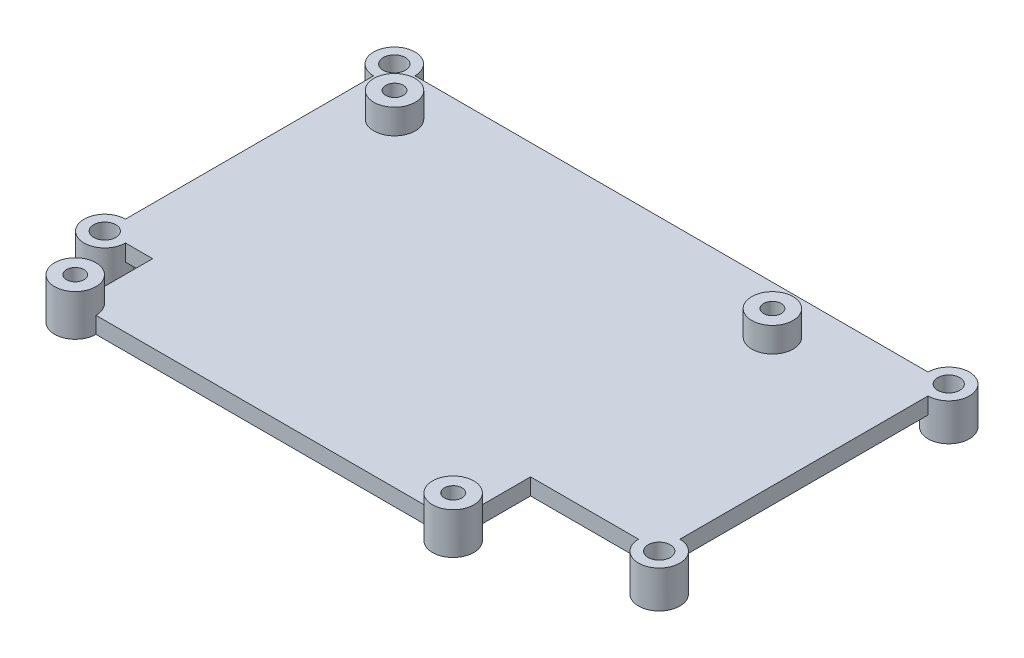
ISO-10303-21;
HEADER;
FILE_DESCRIPTION(('STEP AP214'),'2;1');
FILE_NAME('part.step','',(''),(''),'','','');
FILE_SCHEMA(('AUTOMOTIVE_DESIGN { 1 0 10303 214 1 1 1 1 }'));
ENDSEC;
DATA;
#1=APPLICATION_CONTEXT('core data for automotive mechanical design processes');
#2=APPLICATION_PROTOCOL_DEFINITION('international standard','automotive_design',2000,#1);
#3=PRODUCT_CONTEXT('',#1,'mechanical');
#4=PRODUCT('Part','Part','',(#3));
#5=PRODUCT_RELATED_PRODUCT_CATEGORY('part','',(#4));
#6=PRODUCT_DEFINITION_FORMATION('','',#4);
#7=PRODUCT_DEFINITION_CONTEXT('part definition',#1,'design');
#8=PRODUCT_DEFINITION('design','',#6,#7);
#9=PRODUCT_DEFINITION_SHAPE('','',#8);
#10=(LENGTH_UNIT() NAMED_UNIT(*) SI_UNIT(.MILLI.,.METRE.));
#11=(NAMED_UNIT(*) PLANE_ANGLE_UNIT() SI_UNIT($,.RADIAN.));
#12=(NAMED_UNIT(*) SI_UNIT($,.STERADIAN.) SOLID_ANGLE_UNIT());
#13=UNCERTAINTY_MEASURE_WITH_UNIT(LENGTH_MEASURE(1.E-05),#10,'distance_accuracy_value','');
#14=(GEOMETRIC_REPRESENTATION_CONTEXT(3) GLOBAL_UNCERTAINTY_ASSIGNED_CONTEXT((#13)) GLOBAL_UNIT_ASSIGNED_CONTEXT((#10,
#11,#12)) REPRESENTATION_CONTEXT('',''));
#15=CARTESIAN_POINT('',(0.,0.,0.));
#16=DIRECTION('',(0.,0.,1.));
#17=DIRECTION('',(1.,0.,0.));
#18=AXIS2_PLACEMENT_3D('',#15,#16,#17);
#19=CARTESIAN_POINT('',(0.,2.54,0.));
#20=DIRECTION('',(0.,1.,0.));
#21=DIRECTION('',(0.,0.,1.));
#22=AXIS2_PLACEMENT_3D('',#19,#20,#21);
#23=PLANE('',#22);
#24=CARTESIAN_POINT('',(178.110999752416,2.54,106.660124546003));
#25=DIRECTION('',(0.,1.,0.));
#26=DIRECTION('',(0.,0.,1.));
#27=AXIS2_PLACEMENT_3D('',#24,#25,#26);
#28=CIRCLE('',#27,1.69999999999996);
#29=CARTESIAN_POINT('',(178.110999752416,2.54,108.360124546003));
#30=VERTEX_POINT('',#29);
#31=EDGE_CURVE('E187',#30,#30,#28,.T.);
#32=ORIENTED_EDGE('',*,*,#31,.F.);
#33=EDGE_LOOP('',(#32));
#34=FACE_BOUND('',#33,.T.);
#35=CARTESIAN_POINT('',(178.108885441775,2.54,62.2211245963));
#36=DIRECTION('',(0.,1.,0.));
#37=DIRECTION('',(0.,0.,1.));
#38=AXIS2_PLACEMENT_3D('',#35,#36,#37);
#39=CIRCLE('',#38,1.69999999999996);
#40=CARTESIAN_POINT('',(178.108885441775,2.54,63.9211245963));
#41=VERTEX_POINT('',#40);
#42=EDGE_CURVE('E184',#41,#41,#39,.T.);
#43=ORIENTED_EDGE('',*,*,#42,.F.);
#44=EDGE_LOOP('',(#43));
#45=FACE_BOUND('',#44,.T.);
#46=CARTESIAN_POINT('',(93.0188855380824,2.54,62.2251729928077));
#47=DIRECTION('',(0.,1.,0.));
#48=DIRECTION('',(0.,0.,1.));
#49=AXIS2_PLACEMENT_3D('',#46,#47,#48);
#50=CIRCLE('',#49,1.69999999999998);
#51=CARTESIAN_POINT('',(93.0188855380824,2.54,63.9251729928077));
#52=VERTEX_POINT('',#51);
#53=EDGE_CURVE('E181',#52,#52,#50,.T.);
#54=ORIENTED_EDGE('',*,*,#53,.F.);
#55=EDGE_LOOP('',(#54));
#56=FACE_BOUND('',#55,.T.);
#57=CARTESIAN_POINT('',(93.020999848723,2.54,106.664172942511));
#58=DIRECTION('',(0.,1.,0.));
#59=DIRECTION('',(0.,0.,1.));
#60=AXIS2_PLACEMENT_3D('',#57,#58,#59);
#61=CIRCLE('',#60,1.69999999999999);
#62=CARTESIAN_POINT('',(93.020999848723,2.54,108.364172942511));
#63=VERTEX_POINT('',#62);
#64=EDGE_CURVE('E178',#63,#63,#61,.T.);
#65=ORIENTED_EDGE('',*,*,#64,.F.);
#66=EDGE_LOOP('',(#65));
#67=FACE_BOUND('',#66,.T.);
#68=CARTESIAN_POINT('',(100.361892411945,2.54,69.5351729928077));
#69=DIRECTION('',(0.,1.,0.));
#70=DIRECTION('',(0.,0.,1.));
#71=AXIS2_PLACEMENT_3D('',#68,#69,#70);
#72=CIRCLE('',#71,3.175);
#73=CARTESIAN_POINT('',(100.361892411945,2.54,72.7101729928077));
#74=VERTEX_POINT('',#73);
#75=EDGE_CURVE('E264',#74,#74,#72,.F.);
#76=ORIENTED_EDGE('',*,*,#75,.T.);
#77=EDGE_LOOP('',(#76));
#78=FACE_BOUND('',#77,.T.);
#79=CARTESIAN_POINT('',(158.361892411945,2.54,69.5351729928077));
#80=DIRECTION('',(0.,1.,0.));
#81=DIRECTION('',(0.,0.,1.));
#82=AXIS2_PLACEMENT_3D('',#79,#80,#81);
#83=CIRCLE('',#82,3.175);
#84=CARTESIAN_POINT('',(158.361892411945,2.54,72.7101729928077));
#85=VERTEX_POINT('',#84);
#86=EDGE_CURVE('E268',#85,#85,#83,.F.);
#87=ORIENTED_EDGE('',*,*,#86,.T.);
#88=EDGE_LOOP('',(#87));
#89=FACE_BOUND('',#88,.T.);
#90=DIRECTION('',(1.,0.,0.));
#91=VECTOR('',#90,1.);
#92=CARTESIAN_POINT('',(0.,2.54,118.535172992808));
#93=LINE('',#92,#91);
#94=CARTESIAN_POINT('',(103.536892411945,2.54,118.535172992808));
#95=VERTEX_POINT('',#94);
#96=CARTESIAN_POINT('',(155.186892411945,2.54,118.535172992808));
#97=VERTEX_POINT('',#96);
#98=EDGE_CURVE('E337',#95,#97,#93,.T.);
#99=ORIENTED_EDGE('',*,*,#98,.T.);
#100=CARTESIAN_POINT('',(158.361892411945,2.54,118.535172992808));
#101=DIRECTION('',(0.,1.,0.));
#102=DIRECTION('',(0.,0.,1.));
#103=AXIS2_PLACEMENT_3D('',#100,#101,#102);
#104=CIRCLE('',#103,3.175);
#105=CARTESIAN_POINT('',(158.361892411945,2.54,115.360172992808));
#106=VERTEX_POINT('',#105);
#107=EDGE_CURVE('E11',#97,#106,#104,.F.);
#108=ORIENTED_EDGE('',*,*,#107,.T.);
#109=DIRECTION('',(0.,0.,1.));
#110=VECTOR('',#109,1.);
#111=CARTESIAN_POINT('',(158.361892411945,2.54,0.));
#112=LINE('',#111,#110);
#113=CARTESIAN_POINT('',(158.361892411945,2.54,106.660124546003));
#114=VERTEX_POINT('',#113);
#115=EDGE_CURVE('E339',#114,#106,#112,.T.);
#116=ORIENTED_EDGE('',*,*,#115,.F.);
#117=DIRECTION('',(1.,0.,0.));
#118=VECTOR('',#117,1.);
#119=CARTESIAN_POINT('',(0.,2.54,106.660124546003));
#120=LINE('',#119,#118);
#121=CARTESIAN_POINT('',(174.935999752416,2.54,106.660124546003));
#122=VERTEX_POINT('',#121);
#123=EDGE_CURVE('E342',#114,#122,#120,.T.);
#124=ORIENTED_EDGE('',*,*,#123,.T.);
#125=CARTESIAN_POINT('',(178.110999752416,2.54,106.660124546003));
#126=DIRECTION('',(0.,1.,0.));
#127=DIRECTION('',(0.,0.,1.));
#128=AXIS2_PLACEMENT_3D('',#125,#126,#127);
#129=CIRCLE('',#128,3.17499999999998);
#130=CARTESIAN_POINT('',(178.110999752416,2.54,103.485124546003));
#131=VERTEX_POINT('',#130);
#132=EDGE_CURVE('E344',#122,#131,#129,.T.);
#133=ORIENTED_EDGE('',*,*,#132,.T.);
#134=DIRECTION('',(0.,0.,1.));
#135=VECTOR('',#134,1.);
#136=CARTESIAN_POINT('',(178.110999752416,2.54,0.));
#137=LINE('',#136,#135);
#138=CARTESIAN_POINT('',(178.110999752416,2.54,65.3961238923142));
#139=VERTEX_POINT('',#138);
#140=EDGE_CURVE('E173',#139,#131,#137,.T.);
#141=ORIENTED_EDGE('',*,*,#140,.F.);
#142=CARTESIAN_POINT('',(178.108885441775,2.54,62.2211245963));
#143=DIRECTION('',(0.,1.,0.));
#144=DIRECTION('',(0.,0.,1.));
#145=AXIS2_PLACEMENT_3D('',#142,#143,#144);
#146=CIRCLE('',#145,3.175);
#147=CARTESIAN_POINT('',(174.933888022802,2.54,62.2251729928077));
#148=VERTEX_POINT('',#147);
#149=EDGE_CURVE('E170',#139,#148,#146,.T.);
#150=ORIENTED_EDGE('',*,*,#149,.T.);
#151=DIRECTION('',(1.,0.,0.));
#152=VECTOR('',#151,1.);
#153=CARTESIAN_POINT('',(0.,2.54,62.2251729928077));
#154=LINE('',#153,#152);
#155=CARTESIAN_POINT('',(96.1938855380824,2.54,62.2251729928077));
#156=VERTEX_POINT('',#155);
#157=EDGE_CURVE('E157',#156,#148,#154,.T.);
#158=ORIENTED_EDGE('',*,*,#157,.F.);
#159=CARTESIAN_POINT('',(93.0188855380824,2.54,62.2251729928077));
#160=DIRECTION('',(0.,1.,0.));
#161=DIRECTION('',(0.,0.,1.));
#162=AXIS2_PLACEMENT_3D('',#159,#160,#161);
#163=CIRCLE('',#162,3.17499999999998);
#164=CARTESIAN_POINT('',(93.0188855380824,2.54,65.4001729928077));
#165=VERTEX_POINT('',#164);
#166=EDGE_CURVE('E164',#156,#165,#163,.T.);
#167=ORIENTED_EDGE('',*,*,#166,.T.);
#168=DIRECTION('',(0.,0.,1.));
#169=VECTOR('',#168,1.);
#170=CARTESIAN_POINT('',(93.0188855380824,2.54,0.));
#171=LINE('',#170,#169);
#172=CARTESIAN_POINT('',(93.0188855380824,2.54,103.489173646496));
#173=VERTEX_POINT('',#172);
#174=EDGE_CURVE('E60',#165,#173,#171,.T.);
#175=ORIENTED_EDGE('',*,*,#174,.T.);
#176=CARTESIAN_POINT('',(93.020999848723,2.54,106.664172942511));
#177=DIRECTION('',(0.,1.,0.));
#178=DIRECTION('',(0.,0.,1.));
#179=AXIS2_PLACEMENT_3D('',#176,#177,#178);
#180=CIRCLE('',#179,3.17499999999998);
#181=CARTESIAN_POINT('',(96.1959998487229,2.54,106.664172942511));
#182=VERTEX_POINT('',#181);
#183=EDGE_CURVE('E230',#182,#173,#180,.F.);
#184=ORIENTED_EDGE('',*,*,#183,.F.);
#185=DIRECTION('',(2.37888153894133E-05,0.,0.999999999717046));
#186=VECTOR('',#185,1.);
#187=CARTESIAN_POINT('',(96.1934623799668,2.54,-0.002288328518873));
#188=LINE('',#187,#186);
#189=CARTESIAN_POINT('',(96.1959998451294,2.54,106.664021882939));
#190=VERTEX_POINT('',#189);
#191=EDGE_CURVE('E328',#190,#182,#188,.T.);
#192=ORIENTED_EDGE('',*,*,#191,.F.);
#193=CARTESIAN_POINT('',(96.195997267696,2.54,106.660124546003));
#194=VERTEX_POINT('',#193);
#195=EDGE_CURVE('E329',#194,#190,#180,.F.);
#196=ORIENTED_EDGE('',*,*,#195,.F.);
#197=DIRECTION('',(1.,0.,0.));
#198=VECTOR('',#197,1.);
#199=CARTESIAN_POINT('',(0.,2.54,106.660124546003));
#200=LINE('',#199,#198);
#201=CARTESIAN_POINT('',(100.361892411945,2.54,106.660124546003));
#202=VERTEX_POINT('',#201);
#203=EDGE_CURVE('E332',#194,#202,#200,.T.);
#204=ORIENTED_EDGE('',*,*,#203,.T.);
#205=DIRECTION('',(0.,0.,1.));
#206=VECTOR('',#205,1.);
#207=CARTESIAN_POINT('',(100.361892411945,2.54,0.));
#208=LINE('',#207,#206);
#209=CARTESIAN_POINT('',(100.361892411945,2.54,115.360172992808));
#210=VERTEX_POINT('',#209);
#211=EDGE_CURVE('E334',#202,#210,#208,.T.);
#212=ORIENTED_EDGE('',*,*,#211,.T.);
#213=CARTESIAN_POINT('',(100.361892411945,2.54,118.535172992808));
#214=DIRECTION('',(0.,1.,0.));
#215=DIRECTION('',(0.,0.,1.));
#216=AXIS2_PLACEMENT_3D('',#213,#214,#215);
#217=CIRCLE('',#216,3.175);
#218=EDGE_CURVE('E52',#95,#210,#217,.T.);
#219=ORIENTED_EDGE('',*,*,#218,.F.);
#220=EDGE_LOOP('',(#99,#108,#116,#124,#133,#141,#150,#158,#167,#175,#184,#192,#196,#204,#212,#219));
#221=FACE_BOUND('',#220,.T.);
#222=ADVANCED_FACE('F43',(#34,#45,#56,#67,#78,#89,#221),#23,.T.);
#223=CARTESIAN_POINT('',(0.,0.,0.));
#224=DIRECTION('',(0.,1.,0.));
#225=DIRECTION('',(0.,0.,1.));
#226=AXIS2_PLACEMENT_3D('',#223,#224,#225);
#227=PLANE('',#226);
#228=CARTESIAN_POINT('',(158.361892411945,0.,118.535172992808));
#229=DIRECTION('',(0.,1.,0.));
#230=DIRECTION('',(0.,0.,1.));
#231=AXIS2_PLACEMENT_3D('',#228,#229,#230);
#232=CIRCLE('',#231,1.35);
#233=CARTESIAN_POINT('',(158.361892411945,0.,119.885172992808));
#234=VERTEX_POINT('',#233);
#235=EDGE_CURVE('E227',#234,#234,#232,.T.);
#236=ORIENTED_EDGE('',*,*,#235,.T.);
#237=EDGE_LOOP('',(#236));
#238=FACE_BOUND('',#237,.T.);
#239=CARTESIAN_POINT('',(158.361892411945,0.,118.535172992808));
#240=DIRECTION('',(0.,1.,0.));
#241=DIRECTION('',(0.,0.,1.));
#242=AXIS2_PLACEMENT_3D('',#239,#240,#241);
#243=CIRCLE('',#242,3.175);
#244=CARTESIAN_POINT('',(155.186892411945,0.,118.535172992808));
#245=VERTEX_POINT('',#244);
#246=CARTESIAN_POINT('',(158.361892411945,0.,115.360172992808));
#247=VERTEX_POINT('',#246);
#248=EDGE_CURVE('E202',#245,#247,#243,.T.);
#249=ORIENTED_EDGE('',*,*,#248,.F.);
#250=DIRECTION('',(1.,0.,0.));
#251=VECTOR('',#250,1.);
#252=CARTESIAN_POINT('',(0.,0.,118.535172992808));
#253=LINE('',#252,#251);
#254=CARTESIAN_POINT('',(103.536892411945,0.,118.535172992808));
#255=VERTEX_POINT('',#254);
#256=EDGE_CURVE('E200',#255,#245,#253,.T.);
#257=ORIENTED_EDGE('',*,*,#256,.F.);
#258=CARTESIAN_POINT('',(100.361892411945,0.,118.535172992808));
#259=DIRECTION('',(0.,1.,0.));
#260=DIRECTION('',(0.,0.,1.));
#261=AXIS2_PLACEMENT_3D('',#258,#259,#260);
#262=CIRCLE('',#261,3.175);
#263=CARTESIAN_POINT('',(100.361892411945,0.,115.360172992808));
#264=VERTEX_POINT('',#263);
#265=EDGE_CURVE('E197',#255,#264,#262,.F.);
#266=ORIENTED_EDGE('',*,*,#265,.T.);
#267=DIRECTION('',(0.,0.,1.));
#268=VECTOR('',#267,1.);
#269=CARTESIAN_POINT('',(100.361892411945,0.,0.));
#270=LINE('',#269,#268);
#271=CARTESIAN_POINT('',(100.361892411945,0.,106.660124546003));
#272=VERTEX_POINT('',#271);
#273=EDGE_CURVE('E193',#272,#264,#270,.T.);
#274=ORIENTED_EDGE('',*,*,#273,.F.);
#275=DIRECTION('',(1.,0.,0.));
#276=VECTOR('',#275,1.);
#277=CARTESIAN_POINT('',(0.,0.,106.660124546003));
#278=LINE('',#277,#276);
#279=CARTESIAN_POINT('',(96.195997267696,0.,106.660124546003));
#280=VERTEX_POINT('',#279);
#281=EDGE_CURVE('E191',#280,#272,#278,.T.);
#282=ORIENTED_EDGE('',*,*,#281,.F.);
#283=CARTESIAN_POINT('',(93.020999848723,0.,106.664172942511));
#284=DIRECTION('',(0.,1.,0.));
#285=DIRECTION('',(0.,0.,1.));
#286=AXIS2_PLACEMENT_3D('',#283,#284,#285);
#287=CIRCLE('',#286,3.17499999999998);
#288=CARTESIAN_POINT('',(93.0188855380824,0.,103.489173646496));
#289=VERTEX_POINT('',#288);
#290=EDGE_CURVE('E107',#289,#280,#287,.F.);
#291=ORIENTED_EDGE('',*,*,#290,.F.);
#292=DIRECTION('',(0.,0.,1.));
#293=VECTOR('',#292,1.);
#294=CARTESIAN_POINT('',(93.0188855380824,0.,0.));
#295=LINE('',#294,#293);
#296=CARTESIAN_POINT('',(93.0188855380824,0.,65.4001729928077));
#297=VERTEX_POINT('',#296);
#298=EDGE_CURVE('E215',#297,#289,#295,.T.);
#299=ORIENTED_EDGE('',*,*,#298,.F.);
#300=CARTESIAN_POINT('',(93.0188855380824,0.,62.2251729928077));
#301=DIRECTION('',(0.,1.,0.));
#302=DIRECTION('',(0.,0.,1.));
#303=AXIS2_PLACEMENT_3D('',#300,#301,#302);
#304=CIRCLE('',#303,3.17499999999998);
#305=CARTESIAN_POINT('',(96.1938855380824,0.,62.2251729928077));
#306=VERTEX_POINT('',#305);
#307=EDGE_CURVE('E99',#297,#306,#304,.T.);
#308=ORIENTED_EDGE('',*,*,#307,.T.);
#309=DIRECTION('',(1.,0.,0.));
#310=VECTOR('',#309,1.);
#311=CARTESIAN_POINT('',(0.,0.,62.2251729928077));
#312=LINE('',#311,#310);
#313=CARTESIAN_POINT('',(174.933888022802,0.,62.2251729928077));
#314=VERTEX_POINT('',#313);
#315=EDGE_CURVE('E160',#306,#314,#312,.T.);
#316=ORIENTED_EDGE('',*,*,#315,.T.);
#317=CARTESIAN_POINT('',(178.108885441775,0.,62.2211245963));
#318=DIRECTION('',(0.,1.,0.));
#319=DIRECTION('',(0.,0.,1.));
#320=AXIS2_PLACEMENT_3D('',#317,#318,#319);
#321=CIRCLE('',#320,3.175);
#322=CARTESIAN_POINT('',(178.110999752416,0.,65.3961238923142));
#323=VERTEX_POINT('',#322);
#324=EDGE_CURVE('E300',#314,#323,#321,.T.);
#325=ORIENTED_EDGE('',*,*,#324,.T.);
#326=DIRECTION('',(0.,0.,1.));
#327=VECTOR('',#326,1.);
#328=CARTESIAN_POINT('',(178.110999752416,0.,0.));
#329=LINE('',#328,#327);
#330=CARTESIAN_POINT('',(178.110999752416,0.,103.485124546003));
#331=VERTEX_POINT('',#330);
#332=EDGE_CURVE('E211',#323,#331,#329,.T.);
#333=ORIENTED_EDGE('',*,*,#332,.T.);
#334=CARTESIAN_POINT('',(178.110999752416,0.,106.660124546003));
#335=DIRECTION('',(0.,1.,0.));
#336=DIRECTION('',(0.,0.,1.));
#337=AXIS2_PLACEMENT_3D('',#334,#335,#336);
#338=CIRCLE('',#337,3.17499999999998);
#339=CARTESIAN_POINT('',(174.935999752416,0.,106.660124546003));
#340=VERTEX_POINT('',#339);
#341=EDGE_CURVE('E293',#331,#340,#338,.T.);
#342=ORIENTED_EDGE('',*,*,#341,.T.);
#343=DIRECTION('',(1.,0.,0.));
#344=VECTOR('',#343,1.);
#345=CARTESIAN_POINT('',(0.,0.,106.660124546003));
#346=LINE('',#345,#344);
#347=CARTESIAN_POINT('',(158.361892411945,0.,106.660124546003));
#348=VERTEX_POINT('',#347);
#349=EDGE_CURVE('E208',#348,#340,#346,.T.);
#350=ORIENTED_EDGE('',*,*,#349,.F.);
#351=DIRECTION('',(0.,0.,1.));
#352=VECTOR('',#351,1.);
#353=CARTESIAN_POINT('',(158.361892411945,0.,0.));
#354=LINE('',#353,#352);
#355=EDGE_CURVE('E205',#348,#247,#354,.T.);
#356=ORIENTED_EDGE('',*,*,#355,.T.);
#357=EDGE_LOOP('',(#249,#257,#266,#274,#282,#291,#299,#308,#316,#325,#333,#342,#350,#356));
#358=FACE_BOUND('',#357,.T.);
#359=CARTESIAN_POINT('',(158.361892411945,0.,69.5351729928077));
#360=DIRECTION('',(0.,1.,0.));
#361=DIRECTION('',(0.,0.,1.));
#362=AXIS2_PLACEMENT_3D('',#359,#360,#361);
#363=CIRCLE('',#362,1.35);
#364=CARTESIAN_POINT('',(158.361892411945,0.,70.8851729928077));
#365=VERTEX_POINT('',#364);
#366=EDGE_CURVE('E218',#365,#365,#363,.T.);
#367=ORIENTED_EDGE('',*,*,#366,.T.);
#368=EDGE_LOOP('',(#367));
#369=FACE_BOUND('',#368,.T.);
#370=CARTESIAN_POINT('',(100.361892411945,0.,69.5351729928077));
#371=DIRECTION('',(0.,1.,0.));
#372=DIRECTION('',(0.,0.,1.));
#373=AXIS2_PLACEMENT_3D('',#370,#371,#372);
#374=CIRCLE('',#373,1.35);
#375=CARTESIAN_POINT('',(100.361892411945,0.,70.8851729928077));
#376=VERTEX_POINT('',#375);
#377=EDGE_CURVE('E221',#376,#376,#374,.T.);
#378=ORIENTED_EDGE('',*,*,#377,.T.);
#379=EDGE_LOOP('',(#378));
#380=FACE_BOUND('',#379,.T.);
#381=CARTESIAN_POINT('',(100.361892411945,0.,118.535172992808));
#382=DIRECTION('',(0.,1.,0.));
#383=DIRECTION('',(0.,0.,1.));
#384=AXIS2_PLACEMENT_3D('',#381,#382,#383);
#385=CIRCLE('',#384,1.35);
#386=CARTESIAN_POINT('',(100.361892411945,0.,119.885172992808));
#387=VERTEX_POINT('',#386);
#388=EDGE_CURVE('E224',#387,#387,#385,.T.);
#389=ORIENTED_EDGE('',*,*,#388,.T.);
#390=EDGE_LOOP('',(#389));
#391=FACE_BOUND('',#390,.T.);
#392=ADVANCED_FACE('F360',(#238,#358,#369,#380,#391),#227,.F.);
#393=CARTESIAN_POINT('',(96.1934623799668,2.54,-0.002288328518873));
#394=DIRECTION('',(0.999999999717046,0.,-2.37888153894133E-05));
#395=DIRECTION('',(-2.37888153894133E-05,0.,-0.999999999717046));
#396=AXIS2_PLACEMENT_3D('',#393,#394,#395);
#397=PLANE('',#396);
#398=DIRECTION('',(0.,-1.,0.));
#399=VECTOR('',#398,1.);
#400=CARTESIAN_POINT('',(96.1959998487229,2.54,106.664172942511));
#401=LINE('',#400,#399);
#402=CARTESIAN_POINT('',(96.1959998487229,-3.175,106.664172942511));
#403=VERTEX_POINT('',#402);
#404=EDGE_CURVE('E116',#182,#403,#401,.T.);
#405=ORIENTED_EDGE('',*,*,#404,.T.);
#406=DIRECTION('',(2.37888153894133E-05,0.,0.999999999717046));
#407=VECTOR('',#406,1.);
#408=CARTESIAN_POINT('',(96.1934623799668,-3.175,-0.002288328518873));
#409=LINE('',#408,#407);
#410=CARTESIAN_POINT('',(96.1959998451294,-3.175,106.664021882939));
#411=VERTEX_POINT('',#410);
#412=EDGE_CURVE('E321',#411,#403,#409,.T.);
#413=ORIENTED_EDGE('',*,*,#412,.F.);
#414=DIRECTION('',(0.,-1.,0.));
#415=VECTOR('',#414,1.);
#416=CARTESIAN_POINT('',(96.1959998451294,2.54,106.664021882939));
#417=LINE('',#416,#415);
#418=EDGE_CURVE('E259',#190,#411,#417,.T.);
#419=ORIENTED_EDGE('',*,*,#418,.F.);
#420=ORIENTED_EDGE('',*,*,#191,.T.);
#421=EDGE_LOOP('',(#405,#413,#419,#420));
#422=FACE_BOUND('',#421,.T.);
#423=ADVANCED_FACE('F45',(#422),#397,.T.);
#424=CARTESIAN_POINT('',(93.020999848723,2.54,106.664172942511));
#425=DIRECTION('',(0.,-1.,0.));
#426=DIRECTION('',(0.,0.,-1.));
#427=AXIS2_PLACEMENT_3D('',#424,#425,#426);
#428=CYLINDRICAL_SURFACE('',#427,3.17499999999998);
#429=ORIENTED_EDGE('',*,*,#418,.T.);
#430=CARTESIAN_POINT('',(93.020999848723,-3.175,106.664172942511));
#431=DIRECTION('',(0.,1.,0.));
#432=DIRECTION('',(0.,0.,1.));
#433=AXIS2_PLACEMENT_3D('',#430,#431,#432);
#434=CIRCLE('',#433,3.17499999999998);
#435=EDGE_CURVE('E317',#403,#411,#434,.F.);
#436=ORIENTED_EDGE('',*,*,#435,.F.);
#437=ORIENTED_EDGE('',*,*,#404,.F.);
#438=ORIENTED_EDGE('',*,*,#183,.T.);
#439=DIRECTION('',(0.,-1.,0.));
#440=VECTOR('',#439,1.);
#441=CARTESIAN_POINT('',(93.0188855380824,2.54,103.489173646496));
#442=LINE('',#441,#440);
#443=EDGE_CURVE('E190',#173,#289,#442,.T.);
#444=ORIENTED_EDGE('',*,*,#443,.T.);
#445=ORIENTED_EDGE('',*,*,#290,.T.);
#446=DIRECTION('',(0.,-1.,0.));
#447=VECTOR('',#446,1.);
#448=CARTESIAN_POINT('',(96.195997267696,2.54,106.660124546003));
#449=LINE('',#448,#447);
#450=EDGE_CURVE('E257',#194,#280,#449,.T.);
#451=ORIENTED_EDGE('',*,*,#450,.F.);
#452=ORIENTED_EDGE('',*,*,#195,.T.);
#453=EDGE_LOOP('',(#429,#436,#437,#438,#444,#445,#451,#452));
#454=FACE_BOUND('',#453,.T.);
#455=ADVANCED_FACE('F395',(#454),#428,.T.);
#456=CARTESIAN_POINT('',(0.,2.54,106.660124546003));
#457=DIRECTION('',(0.,0.,-1.));
#458=DIRECTION('',(-1.,0.,0.));
#459=AXIS2_PLACEMENT_3D('',#456,#457,#458);
#460=PLANE('',#459);
#461=ORIENTED_EDGE('',*,*,#281,.T.);
#462=DIRECTION('',(0.,-1.,0.));
#463=VECTOR('',#462,1.);
#464=CARTESIAN_POINT('',(100.361892411945,2.54,106.660124546003));
#465=LINE('',#464,#463);
#466=EDGE_CURVE('E254',#202,#272,#465,.T.);
#467=ORIENTED_EDGE('',*,*,#466,.F.);
#468=ORIENTED_EDGE('',*,*,#203,.F.);
#469=ORIENTED_EDGE('',*,*,#450,.T.);
#470=EDGE_LOOP('',(#461,#467,#468,#469));
#471=FACE_BOUND('',#470,.T.);
#472=ADVANCED_FACE('F523',(#471),#460,.F.);
#473=CARTESIAN_POINT('',(100.361892411945,2.54,0.));
#474=DIRECTION('',(1.,0.,0.));
#475=DIRECTION('',(0.,0.,-1.));
#476=AXIS2_PLACEMENT_3D('',#473,#474,#475);
#477=PLANE('',#476);
#478=ORIENTED_EDGE('',*,*,#273,.T.);
#479=DIRECTION('',(0.,-1.,0.));
#480=VECTOR('',#479,1.);
#481=CARTESIAN_POINT('',(100.361892411945,2.54,115.360172992808));
#482=LINE('',#481,#480);
#483=EDGE_CURVE('E252',#210,#264,#482,.T.);
#484=ORIENTED_EDGE('',*,*,#483,.F.);
#485=ORIENTED_EDGE('',*,*,#211,.F.);
#486=ORIENTED_EDGE('',*,*,#466,.T.);
#487=EDGE_LOOP('',(#478,#484,#485,#486));
#488=FACE_BOUND('',#487,.T.);
#489=ADVANCED_FACE('F520',(#488),#477,.F.);
#490=CARTESIAN_POINT('',(100.361892411945,2.54,118.535172992808));
#491=DIRECTION('',(0.,-1.,0.));
#492=DIRECTION('',(0.,0.,-1.));
#493=AXIS2_PLACEMENT_3D('',#490,#491,#492);
#494=CYLINDRICAL_SURFACE('',#493,3.175);
#495=ORIENTED_EDGE('',*,*,#265,.F.);
#496=DIRECTION('',(0.,-1.,0.));
#497=VECTOR('',#496,1.);
#498=CARTESIAN_POINT('',(103.536892411945,2.54,118.535172992808));
#499=LINE('',#498,#497);
#500=EDGE_CURVE('E250',#95,#255,#499,.T.);
#501=ORIENTED_EDGE('',*,*,#500,.F.);
#502=ORIENTED_EDGE('',*,*,#218,.T.);
#503=ORIENTED_EDGE('',*,*,#483,.T.);
#504=EDGE_LOOP('',(#495,#501,#502,#503));
#505=FACE_BOUND('',#504,.T.);
#506=CARTESIAN_POINT('',(100.361892411945,6.35,118.535172992808));
#507=DIRECTION('',(0.,1.,0.));
#508=DIRECTION('',(0.,0.,1.));
#509=AXIS2_PLACEMENT_3D('',#506,#507,#508);
#510=CIRCLE('',#509,3.175);
#511=CARTESIAN_POINT('',(100.361892411945,6.35,121.710172992808));
#512=VERTEX_POINT('',#511);
#513=EDGE_CURVE('E266',#512,#512,#510,.F.);
#514=ORIENTED_EDGE('',*,*,#513,.T.);
#515=EDGE_LOOP('',(#514));
#516=FACE_BOUND('',#515,.T.);
#517=ADVANCED_FACE('F384',(#505,#516),#494,.T.);
#518=CARTESIAN_POINT('',(0.,2.54,118.535172992808));
#519=DIRECTION('',(0.,0.,-1.));
#520=DIRECTION('',(-1.,0.,0.));
#521=AXIS2_PLACEMENT_3D('',#518,#519,#520);
#522=PLANE('',#521);
#523=ORIENTED_EDGE('',*,*,#256,.T.);
#524=DIRECTION('',(0.,-1.,0.));
#525=VECTOR('',#524,1.);
#526=CARTESIAN_POINT('',(155.186892411945,2.54,118.535172992808));
#527=LINE('',#526,#525);
#528=EDGE_CURVE('E247',#97,#245,#527,.T.);
#529=ORIENTED_EDGE('',*,*,#528,.F.);
#530=ORIENTED_EDGE('',*,*,#98,.F.);
#531=ORIENTED_EDGE('',*,*,#500,.T.);
#532=EDGE_LOOP('',(#523,#529,#530,#531));
#533=FACE_BOUND('',#532,.T.);
#534=ADVANCED_FACE('F381',(#533),#522,.F.);
#535=CARTESIAN_POINT('',(158.361892411945,2.54,118.535172992808));
#536=DIRECTION('',(0.,-1.,0.));
#537=DIRECTION('',(0.,0.,-1.));
#538=AXIS2_PLACEMENT_3D('',#535,#536,#537);
#539=CYLINDRICAL_SURFACE('',#538,3.175);
#540=ORIENTED_EDGE('',*,*,#248,.T.);
#541=DIRECTION('',(0.,-1.,0.));
#542=VECTOR('',#541,1.);
#543=CARTESIAN_POINT('',(158.361892411945,2.54,115.360172992808));
#544=LINE('',#543,#542);
#545=EDGE_CURVE('E245',#106,#247,#544,.T.);
#546=ORIENTED_EDGE('',*,*,#545,.F.);
#547=ORIENTED_EDGE('',*,*,#107,.F.);
#548=ORIENTED_EDGE('',*,*,#528,.T.);
#549=EDGE_LOOP('',(#540,#546,#547,#548));
#550=FACE_BOUND('',#549,.T.);
#551=CARTESIAN_POINT('',(158.361892411945,6.35,118.535172992808));
#552=DIRECTION('',(0.,1.,0.));
#553=DIRECTION('',(0.,0.,1.));
#554=AXIS2_PLACEMENT_3D('',#551,#552,#553);
#555=CIRCLE('',#554,3.175);
#556=CARTESIAN_POINT('',(158.361892411945,6.35,121.710172992808));
#557=VERTEX_POINT('',#556);
#558=EDGE_CURVE('E282',#557,#557,#555,.T.);
#559=ORIENTED_EDGE('',*,*,#558,.F.);
#560=EDGE_LOOP('',(#559));
#561=FACE_BOUND('',#560,.T.);
#562=ADVANCED_FACE('F375',(#550,#561),#539,.T.);
#563=CARTESIAN_POINT('',(158.361892411945,2.54,0.));
#564=DIRECTION('',(1.,0.,0.));
#565=DIRECTION('',(0.,0.,-1.));
#566=AXIS2_PLACEMENT_3D('',#563,#564,#565);
#567=PLANE('',#566);
#568=ORIENTED_EDGE('',*,*,#355,.F.);
#569=DIRECTION('',(0.,-1.,0.));
#570=VECTOR('',#569,1.);
#571=CARTESIAN_POINT('',(158.361892411945,2.54,106.660124546003));
#572=LINE('',#571,#570);
#573=EDGE_CURVE('E243',#114,#348,#572,.T.);
#574=ORIENTED_EDGE('',*,*,#573,.F.);
#575=ORIENTED_EDGE('',*,*,#115,.T.);
#576=ORIENTED_EDGE('',*,*,#545,.T.);
#577=EDGE_LOOP('',(#568,#574,#575,#576));
#578=FACE_BOUND('',#577,.T.);
#579=ADVANCED_FACE('F369',(#578),#567,.T.);
#580=CARTESIAN_POINT('',(0.,2.54,106.660124546003));
#581=DIRECTION('',(0.,0.,-1.));
#582=DIRECTION('',(-1.,0.,0.));
#583=AXIS2_PLACEMENT_3D('',#580,#581,#582);
#584=PLANE('',#583);
#585=ORIENTED_EDGE('',*,*,#349,.T.);
#586=DIRECTION('',(0.,-1.,0.));
#587=VECTOR('',#586,1.);
#588=CARTESIAN_POINT('',(174.935999752416,2.54,106.660124546003));
#589=LINE('',#588,#587);
#590=EDGE_CURVE('E240',#122,#340,#589,.T.);
#591=ORIENTED_EDGE('',*,*,#590,.F.);
#592=ORIENTED_EDGE('',*,*,#123,.F.);
#593=ORIENTED_EDGE('',*,*,#573,.T.);
#594=EDGE_LOOP('',(#585,#591,#592,#593));
#595=FACE_BOUND('',#594,.T.);
#596=ADVANCED_FACE('F367',(#595),#584,.F.);
#597=CARTESIAN_POINT('',(178.110999752416,2.54,106.660124546003));
#598=DIRECTION('',(0.,-1.,0.));
#599=DIRECTION('',(0.,0.,-1.));
#600=AXIS2_PLACEMENT_3D('',#597,#598,#599);
#601=CYLINDRICAL_SURFACE('',#600,3.17499999999998);
#602=ORIENTED_EDGE('',*,*,#590,.T.);
#603=ORIENTED_EDGE('',*,*,#341,.F.);
#604=DIRECTION('',(0.,-1.,0.));
#605=VECTOR('',#604,1.);
#606=CARTESIAN_POINT('',(178.110999752416,2.54,103.485124546003));
#607=LINE('',#606,#605);
#608=EDGE_CURVE('E237',#131,#331,#607,.T.);
#609=ORIENTED_EDGE('',*,*,#608,.F.);
#610=ORIENTED_EDGE('',*,*,#132,.F.);
#611=EDGE_LOOP('',(#602,#603,#609,#610));
#612=FACE_BOUND('',#611,.T.);
#613=CARTESIAN_POINT('',(178.110999752416,-3.175,106.660124546003));
#614=DIRECTION('',(0.,1.,0.));
#615=DIRECTION('',(0.,0.,1.));
#616=AXIS2_PLACEMENT_3D('',#613,#614,#615);
#617=CIRCLE('',#616,3.17499999999998);
#618=CARTESIAN_POINT('',(178.110999752416,-3.175,109.835124546003));
#619=VERTEX_POINT('',#618);
#620=EDGE_CURVE('E297',#619,#619,#617,.T.);
#621=ORIENTED_EDGE('',*,*,#620,.T.);
#622=EDGE_LOOP('',(#621));
#623=FACE_BOUND('',#622,.T.);
#624=ADVANCED_FACE('F355',(#612,#623),#601,.T.);
#625=CARTESIAN_POINT('',(178.110999752416,2.54,0.));
#626=DIRECTION('',(1.,0.,0.));
#627=DIRECTION('',(0.,0.,-1.));
#628=AXIS2_PLACEMENT_3D('',#625,#626,#627);
#629=PLANE('',#628);
#630=ORIENTED_EDGE('',*,*,#332,.F.);
#631=DIRECTION('',(0.,-1.,0.));
#632=VECTOR('',#631,1.);
#633=CARTESIAN_POINT('',(178.110999752416,2.54,65.3961238923142));
#634=LINE('',#633,#632);
#635=EDGE_CURVE('E234',#139,#323,#634,.T.);
#636=ORIENTED_EDGE('',*,*,#635,.F.);
#637=ORIENTED_EDGE('',*,*,#140,.T.);
#638=ORIENTED_EDGE('',*,*,#608,.T.);
#639=EDGE_LOOP('',(#630,#636,#637,#638));
#640=FACE_BOUND('',#639,.T.);
#641=ADVANCED_FACE('F348',(#640),#629,.T.);
#642=CARTESIAN_POINT('',(178.108885441775,2.54,62.2211245963));
#643=DIRECTION('',(0.,-1.,0.));
#644=DIRECTION('',(0.,0.,-1.));
#645=AXIS2_PLACEMENT_3D('',#642,#643,#644);
#646=CYLINDRICAL_SURFACE('',#645,3.175);
#647=ORIENTED_EDGE('',*,*,#635,.T.);
#648=ORIENTED_EDGE('',*,*,#324,.F.);
#649=DIRECTION('',(0.,-1.,0.));
#650=VECTOR('',#649,1.);
#651=CARTESIAN_POINT('',(174.933888022802,2.54,62.2251729928077));
#652=LINE('',#651,#650);
#653=EDGE_CURVE('E161',#148,#314,#652,.T.);
#654=ORIENTED_EDGE('',*,*,#653,.F.);
#655=ORIENTED_EDGE('',*,*,#149,.F.);
#656=EDGE_LOOP('',(#647,#648,#654,#655));
#657=FACE_BOUND('',#656,.T.);
#658=CARTESIAN_POINT('',(178.108885441775,-3.175,62.2211245963));
#659=DIRECTION('',(0.,1.,0.));
#660=DIRECTION('',(0.,0.,1.));
#661=AXIS2_PLACEMENT_3D('',#658,#659,#660);
#662=CIRCLE('',#661,3.175);
#663=CARTESIAN_POINT('',(178.108885441775,-3.175,65.3961245963));
#664=VERTEX_POINT('',#663);
#665=EDGE_CURVE('E306',#664,#664,#662,.T.);
#666=ORIENTED_EDGE('',*,*,#665,.T.);
#667=EDGE_LOOP('',(#666));
#668=FACE_BOUND('',#667,.T.);
#669=ADVANCED_FACE('F500',(#657,#668),#646,.T.);
#670=CARTESIAN_POINT('',(0.,2.54,62.2251729928077));
#671=DIRECTION('',(0.,0.,-1.));
#672=DIRECTION('',(-1.,0.,0.));
#673=AXIS2_PLACEMENT_3D('',#670,#671,#672);
#674=PLANE('',#673);
#675=ORIENTED_EDGE('',*,*,#315,.F.);
#676=DIRECTION('',(0.,-1.,0.));
#677=VECTOR('',#676,1.);
#678=CARTESIAN_POINT('',(96.1938855380824,2.54,62.2251729928077));
#679=LINE('',#678,#677);
#680=EDGE_CURVE('E152',#156,#306,#679,.T.);
#681=ORIENTED_EDGE('',*,*,#680,.F.);
#682=ORIENTED_EDGE('',*,*,#157,.T.);
#683=ORIENTED_EDGE('',*,*,#653,.T.);
#684=EDGE_LOOP('',(#675,#681,#682,#683));
#685=FACE_BOUND('',#684,.T.);
#686=ADVANCED_FACE('F154',(#685),#674,.T.);
#687=CARTESIAN_POINT('',(93.0188855380824,2.54,62.2251729928077));
#688=DIRECTION('',(0.,-1.,0.));
#689=DIRECTION('',(0.,0.,-1.));
#690=AXIS2_PLACEMENT_3D('',#687,#688,#689);
#691=CYLINDRICAL_SURFACE('',#690,3.17499999999998);
#692=ORIENTED_EDGE('',*,*,#680,.T.);
#693=ORIENTED_EDGE('',*,*,#307,.F.);
#694=DIRECTION('',(0.,-1.,0.));
#695=VECTOR('',#694,1.);
#696=CARTESIAN_POINT('',(93.0188855380824,2.54,65.4001729928077));
#697=LINE('',#696,#695);
#698=EDGE_CURVE('E162',#165,#297,#697,.T.);
#699=ORIENTED_EDGE('',*,*,#698,.F.);
#700=ORIENTED_EDGE('',*,*,#166,.F.);
#701=EDGE_LOOP('',(#692,#693,#699,#700));
#702=FACE_BOUND('',#701,.T.);
#703=CARTESIAN_POINT('',(93.0188855380824,-3.175,62.2251729928077));
#704=DIRECTION('',(0.,1.,0.));
#705=DIRECTION('',(0.,0.,1.));
#706=AXIS2_PLACEMENT_3D('',#703,#704,#705);
#707=CIRCLE('',#706,3.17499999999998);
#708=CARTESIAN_POINT('',(93.0188855380824,-3.175,65.4001729928077));
#709=VERTEX_POINT('',#708);
#710=EDGE_CURVE('E314',#709,#709,#707,.T.);
#711=ORIENTED_EDGE('',*,*,#710,.T.);
#712=EDGE_LOOP('',(#711));
#713=FACE_BOUND('',#712,.T.);
#714=ADVANCED_FACE('F165',(#702,#713),#691,.T.);
#715=CARTESIAN_POINT('',(178.110999752416,2.54,106.660124546003));
#716=DIRECTION('',(0.,-1.,0.));
#717=DIRECTION('',(0.,0.,-1.));
#718=AXIS2_PLACEMENT_3D('',#715,#716,#717);
#719=CYLINDRICAL_SURFACE('',#718,1.69999999999996);
#720=ORIENTED_EDGE('',*,*,#31,.T.);
#721=EDGE_LOOP('',(#720));
#722=FACE_BOUND('',#721,.T.);
#723=CARTESIAN_POINT('',(178.110999752416,-3.175,106.660124546003));
#724=DIRECTION('',(0.,1.,0.));
#725=DIRECTION('',(0.,0.,1.));
#726=AXIS2_PLACEMENT_3D('',#723,#724,#725);
#727=CIRCLE('',#726,1.69999999999996);
#728=CARTESIAN_POINT('',(178.110999752416,-3.175,108.360124546003));
#729=VERTEX_POINT('',#728);
#730=EDGE_CURVE('E294',#729,#729,#727,.T.);
#731=ORIENTED_EDGE('',*,*,#730,.F.);
#732=EDGE_LOOP('',(#731));
#733=FACE_BOUND('',#732,.T.);
#734=ADVANCED_FACE('F439',(#722,#733),#719,.F.);
#735=CARTESIAN_POINT('',(178.108885441775,2.54,62.2211245963));
#736=DIRECTION('',(0.,-1.,0.));
#737=DIRECTION('',(0.,0.,-1.));
#738=AXIS2_PLACEMENT_3D('',#735,#736,#737);
#739=CYLINDRICAL_SURFACE('',#738,1.69999999999996);
#740=ORIENTED_EDGE('',*,*,#42,.T.);
#741=EDGE_LOOP('',(#740));
#742=FACE_BOUND('',#741,.T.);
#743=CARTESIAN_POINT('',(178.108885441775,-3.175,62.2211245963));
#744=DIRECTION('',(0.,1.,0.));
#745=DIRECTION('',(0.,0.,1.));
#746=AXIS2_PLACEMENT_3D('',#743,#744,#745);
#747=CIRCLE('',#746,1.69999999999996);
#748=CARTESIAN_POINT('',(178.108885441775,-3.175,63.9211245963));
#749=VERTEX_POINT('',#748);
#750=EDGE_CURVE('E303',#749,#749,#747,.T.);
#751=ORIENTED_EDGE('',*,*,#750,.F.);
#752=EDGE_LOOP('',(#751));
#753=FACE_BOUND('',#752,.T.);
#754=ADVANCED_FACE('F442',(#742,#753),#739,.F.);
#755=CARTESIAN_POINT('',(93.0188855380824,2.54,62.2251729928077));
#756=DIRECTION('',(0.,-1.,0.));
#757=DIRECTION('',(0.,0.,-1.));
#758=AXIS2_PLACEMENT_3D('',#755,#756,#757);
#759=CYLINDRICAL_SURFACE('',#758,1.69999999999998);
#760=ORIENTED_EDGE('',*,*,#53,.T.);
#761=EDGE_LOOP('',(#760));
#762=FACE_BOUND('',#761,.T.);
#763=CARTESIAN_POINT('',(93.0188855380824,-3.175,62.2251729928077));
#764=DIRECTION('',(0.,1.,0.));
#765=DIRECTION('',(0.,0.,1.));
#766=AXIS2_PLACEMENT_3D('',#763,#764,#765);
#767=CIRCLE('',#766,1.69999999999998);
#768=CARTESIAN_POINT('',(93.0188855380824,-3.175,63.9251729928077));
#769=VERTEX_POINT('',#768);
#770=EDGE_CURVE('E311',#769,#769,#767,.T.);
#771=ORIENTED_EDGE('',*,*,#770,.F.);
#772=EDGE_LOOP('',(#771));
#773=FACE_BOUND('',#772,.T.);
#774=ADVANCED_FACE('F446',(#762,#773),#759,.F.);
#775=CARTESIAN_POINT('',(100.361892411945,2.54,118.535172992808));
#776=DIRECTION('',(0.,-1.,0.));
#777=DIRECTION('',(0.,0.,-1.));
#778=AXIS2_PLACEMENT_3D('',#775,#776,#777);
#779=CYLINDRICAL_SURFACE('',#778,1.35);
#780=ORIENTED_EDGE('',*,*,#388,.F.);
#781=EDGE_LOOP('',(#780));
#782=FACE_BOUND('',#781,.T.);
#783=CARTESIAN_POINT('',(100.361892411945,6.35,118.535172992808));
#784=DIRECTION('',(0.,1.,0.));
#785=DIRECTION('',(0.,0.,1.));
#786=AXIS2_PLACEMENT_3D('',#783,#784,#785);
#787=CIRCLE('',#786,1.35);
#788=CARTESIAN_POINT('',(100.361892411945,6.35,119.885172992808));
#789=VERTEX_POINT('',#788);
#790=EDGE_CURVE('E290',#789,#789,#787,.T.);
#791=ORIENTED_EDGE('',*,*,#790,.T.);
#792=EDGE_LOOP('',(#791));
#793=FACE_BOUND('',#792,.T.);
#794=ADVANCED_FACE('F449',(#782,#793),#779,.F.);
#795=CARTESIAN_POINT('',(100.361892411945,2.54,69.5351729928077));
#796=DIRECTION('',(0.,-1.,0.));
#797=DIRECTION('',(0.,0.,-1.));
#798=AXIS2_PLACEMENT_3D('',#795,#796,#797);
#799=CYLINDRICAL_SURFACE('',#798,1.35);
#800=ORIENTED_EDGE('',*,*,#377,.F.);
#801=EDGE_LOOP('',(#800));
#802=FACE_BOUND('',#801,.T.);
#803=CARTESIAN_POINT('',(100.361892411945,6.35,69.5351729928077));
#804=DIRECTION('',(0.,1.,0.));
#805=DIRECTION('',(0.,0.,1.));
#806=AXIS2_PLACEMENT_3D('',#803,#804,#805);
#807=CIRCLE('',#806,1.35);
#808=CARTESIAN_POINT('',(100.361892411945,6.35,70.8851729928077));
#809=VERTEX_POINT('',#808);
#810=EDGE_CURVE('E270',#809,#809,#807,.T.);
#811=ORIENTED_EDGE('',*,*,#810,.T.);
#812=EDGE_LOOP('',(#811));
#813=FACE_BOUND('',#812,.T.);
#814=ADVANCED_FACE('F420',(#802,#813),#799,.F.);
#815=CARTESIAN_POINT('',(158.361892411945,2.54,69.5351729928077));
#816=DIRECTION('',(0.,-1.,0.));
#817=DIRECTION('',(0.,0.,-1.));
#818=AXIS2_PLACEMENT_3D('',#815,#816,#817);
#819=CYLINDRICAL_SURFACE('',#818,1.35);
#820=ORIENTED_EDGE('',*,*,#366,.F.);
#821=EDGE_LOOP('',(#820));
#822=FACE_BOUND('',#821,.T.);
#823=CARTESIAN_POINT('',(158.361892411945,6.35,69.5351729928077));
#824=DIRECTION('',(0.,1.,0.));
#825=DIRECTION('',(0.,0.,1.));
#826=AXIS2_PLACEMENT_3D('',#823,#824,#825);
#827=CIRCLE('',#826,1.35);
#828=CARTESIAN_POINT('',(158.361892411945,6.35,70.8851729928077));
#829=VERTEX_POINT('',#828);
#830=EDGE_CURVE('E277',#829,#829,#827,.T.);
#831=ORIENTED_EDGE('',*,*,#830,.T.);
#832=EDGE_LOOP('',(#831));
#833=FACE_BOUND('',#832,.T.);
#834=ADVANCED_FACE('F410',(#822,#833),#819,.F.);
#835=CARTESIAN_POINT('',(93.020999848723,2.54,106.664172942511));
#836=DIRECTION('',(0.,-1.,0.));
#837=DIRECTION('',(0.,0.,-1.));
#838=AXIS2_PLACEMENT_3D('',#835,#836,#837);
#839=CYLINDRICAL_SURFACE('',#838,1.69999999999999);
#840=ORIENTED_EDGE('',*,*,#64,.T.);
#841=EDGE_LOOP('',(#840));
#842=FACE_BOUND('',#841,.T.);
#843=CARTESIAN_POINT('',(93.020999848723,-3.175,106.664172942511));
#844=DIRECTION('',(0.,1.,0.));
#845=DIRECTION('',(0.,0.,1.));
#846=AXIS2_PLACEMENT_3D('',#843,#844,#845);
#847=CIRCLE('',#846,1.69999999999999);
#848=CARTESIAN_POINT('',(93.020999848723,-3.175,108.364172942511));
#849=VERTEX_POINT('',#848);
#850=EDGE_CURVE('E194',#849,#849,#847,.T.);
#851=ORIENTED_EDGE('',*,*,#850,.F.);
#852=EDGE_LOOP('',(#851));
#853=FACE_BOUND('',#852,.T.);
#854=ADVANCED_FACE('F407',(#842,#853),#839,.F.);
#855=CARTESIAN_POINT('',(93.0188855380824,2.54,0.));
#856=DIRECTION('',(1.,0.,0.));
#857=DIRECTION('',(0.,0.,-1.));
#858=AXIS2_PLACEMENT_3D('',#855,#856,#857);
#859=PLANE('',#858);
#860=ORIENTED_EDGE('',*,*,#298,.T.);
#861=ORIENTED_EDGE('',*,*,#443,.F.);
#862=ORIENTED_EDGE('',*,*,#174,.F.);
#863=ORIENTED_EDGE('',*,*,#698,.T.);
#864=EDGE_LOOP('',(#860,#861,#862,#863));
#865=FACE_BOUND('',#864,.T.);
#866=ADVANCED_FACE('F409',(#865),#859,.F.);
#867=CARTESIAN_POINT('',(158.361892411945,2.54,118.535172992808));
#868=DIRECTION('',(0.,-1.,0.));
#869=DIRECTION('',(0.,0.,-1.));
#870=AXIS2_PLACEMENT_3D('',#867,#868,#869);
#871=CYLINDRICAL_SURFACE('',#870,1.35);
#872=ORIENTED_EDGE('',*,*,#235,.F.);
#873=EDGE_LOOP('',(#872));
#874=FACE_BOUND('',#873,.T.);
#875=CARTESIAN_POINT('',(158.361892411945,6.35,118.535172992808));
#876=DIRECTION('',(0.,1.,0.));
#877=DIRECTION('',(0.,0.,1.));
#878=AXIS2_PLACEMENT_3D('',#875,#876,#877);
#879=CIRCLE('',#878,1.35);
#880=CARTESIAN_POINT('',(158.361892411945,6.35,119.885172992808));
#881=VERTEX_POINT('',#880);
#882=EDGE_CURVE('E853',#881,#881,#879,.T.);
#883=ORIENTED_EDGE('',*,*,#882,.T.);
#884=EDGE_LOOP('',(#883));
#885=FACE_BOUND('',#884,.T.);
#886=ADVANCED_FACE('F403',(#874,#885),#871,.F.);
#887=CARTESIAN_POINT('',(0.,-3.175,0.));
#888=DIRECTION('',(0.,1.,0.));
#889=DIRECTION('',(0.,0.,1.));
#890=AXIS2_PLACEMENT_3D('',#887,#888,#889);
#891=PLANE('',#890);
#892=ORIENTED_EDGE('',*,*,#435,.T.);
#893=ORIENTED_EDGE('',*,*,#412,.T.);
#894=EDGE_LOOP('',(#892,#893));
#895=FACE_BOUND('',#894,.T.);
#896=ORIENTED_EDGE('',*,*,#850,.T.);
#897=EDGE_LOOP('',(#896));
#898=FACE_BOUND('',#897,.T.);
#899=ADVANCED_FACE('F399',(#895,#898),#891,.F.);
#900=CARTESIAN_POINT('',(0.,-3.175,0.));
#901=DIRECTION('',(0.,1.,0.));
#902=DIRECTION('',(0.,0.,1.));
#903=AXIS2_PLACEMENT_3D('',#900,#901,#902);
#904=PLANE('',#903);
#905=ORIENTED_EDGE('',*,*,#770,.T.);
#906=EDGE_LOOP('',(#905));
#907=FACE_BOUND('',#906,.T.);
#908=ORIENTED_EDGE('',*,*,#710,.F.);
#909=EDGE_LOOP('',(#908));
#910=FACE_BOUND('',#909,.T.);
#911=ADVANCED_FACE('F402',(#907,#910),#904,.F.);
#912=CARTESIAN_POINT('',(0.,-3.175,0.));
#913=DIRECTION('',(0.,1.,0.));
#914=DIRECTION('',(0.,0.,1.));
#915=AXIS2_PLACEMENT_3D('',#912,#913,#914);
#916=PLANE('',#915);
#917=ORIENTED_EDGE('',*,*,#750,.T.);
#918=EDGE_LOOP('',(#917));
#919=FACE_BOUND('',#918,.T.);
#920=ORIENTED_EDGE('',*,*,#665,.F.);
#921=EDGE_LOOP('',(#920));
#922=FACE_BOUND('',#921,.T.);
#923=ADVANCED_FACE('F484',(#919,#922),#916,.F.);
#924=CARTESIAN_POINT('',(0.,-3.175,0.));
#925=DIRECTION('',(0.,1.,0.));
#926=DIRECTION('',(0.,0.,1.));
#927=AXIS2_PLACEMENT_3D('',#924,#925,#926);
#928=PLANE('',#927);
#929=ORIENTED_EDGE('',*,*,#730,.T.);
#930=EDGE_LOOP('',(#929));
#931=FACE_BOUND('',#930,.T.);
#932=ORIENTED_EDGE('',*,*,#620,.F.);
#933=EDGE_LOOP('',(#932));
#934=FACE_BOUND('',#933,.T.);
#935=ADVANCED_FACE('F477',(#931,#934),#928,.F.);
#936=CARTESIAN_POINT('',(0.,6.35,0.));
#937=DIRECTION('',(0.,1.,0.));
#938=DIRECTION('',(0.,0.,1.));
#939=AXIS2_PLACEMENT_3D('',#936,#937,#938);
#940=PLANE('',#939);
#941=ORIENTED_EDGE('',*,*,#513,.F.);
#942=EDGE_LOOP('',(#941));
#943=FACE_BOUND('',#942,.T.);
#944=ORIENTED_EDGE('',*,*,#790,.F.);
#945=EDGE_LOOP('',(#944));
#946=FACE_BOUND('',#945,.T.);
#947=ADVANCED_FACE('F471',(#943,#946),#940,.T.);
#948=CARTESIAN_POINT('',(100.361892411945,6.35,69.5351729928077));
#949=DIRECTION('',(0.,-1.,0.));
#950=DIRECTION('',(0.,0.,-1.));
#951=AXIS2_PLACEMENT_3D('',#948,#949,#950);
#952=CYLINDRICAL_SURFACE('',#951,3.175);
#953=ORIENTED_EDGE('',*,*,#75,.F.);
#954=EDGE_LOOP('',(#953));
#955=FACE_BOUND('',#954,.T.);
#956=CARTESIAN_POINT('',(100.361892411945,6.35,69.5351729928077));
#957=DIRECTION('',(0.,1.,0.));
#958=DIRECTION('',(0.,0.,1.));
#959=AXIS2_PLACEMENT_3D('',#956,#957,#958);
#960=CIRCLE('',#959,3.175);
#961=CARTESIAN_POINT('',(100.361892411945,6.35,72.7101729928077));
#962=VERTEX_POINT('',#961);
#963=EDGE_CURVE('E267',#962,#962,#960,.T.);
#964=ORIENTED_EDGE('',*,*,#963,.F.);
#965=EDGE_LOOP('',(#964));
#966=FACE_BOUND('',#965,.T.);
#967=ADVANCED_FACE('F466',(#955,#966),#952,.T.);
#968=CARTESIAN_POINT('',(0.,6.35,0.));
#969=DIRECTION('',(0.,1.,0.));
#970=DIRECTION('',(0.,0.,1.));
#971=AXIS2_PLACEMENT_3D('',#968,#969,#970);
#972=PLANE('',#971);
#973=ORIENTED_EDGE('',*,*,#810,.F.);
#974=EDGE_LOOP('',(#973));
#975=FACE_BOUND('',#974,.T.);
#976=ORIENTED_EDGE('',*,*,#963,.T.);
#977=EDGE_LOOP('',(#976));
#978=FACE_BOUND('',#977,.T.);
#979=ADVANCED_FACE('F462',(#975,#978),#972,.T.);
#980=CARTESIAN_POINT('',(158.361892411945,6.35,69.5351729928077));
#981=DIRECTION('',(0.,-1.,0.));
#982=DIRECTION('',(0.,0.,-1.));
#983=AXIS2_PLACEMENT_3D('',#980,#981,#982);
#984=CYLINDRICAL_SURFACE('',#983,3.175);
#985=ORIENTED_EDGE('',*,*,#86,.F.);
#986=EDGE_LOOP('',(#985));
#987=FACE_BOUND('',#986,.T.);
#988=CARTESIAN_POINT('',(158.361892411945,6.35,69.5351729928077));
#989=DIRECTION('',(0.,1.,0.));
#990=DIRECTION('',(0.,0.,1.));
#991=AXIS2_PLACEMENT_3D('',#988,#989,#990);
#992=CIRCLE('',#991,3.175);
#993=CARTESIAN_POINT('',(158.361892411945,6.35,72.7101729928077));
#994=VERTEX_POINT('',#993);
#995=EDGE_CURVE('E271',#994,#994,#992,.T.);
#996=ORIENTED_EDGE('',*,*,#995,.F.);
#997=EDGE_LOOP('',(#996));
#998=FACE_BOUND('',#997,.T.);
#999=ADVANCED_FACE('F465',(#987,#998),#984,.T.);
#1000=CARTESIAN_POINT('',(0.,6.35,0.));
#1001=DIRECTION('',(0.,1.,0.));
#1002=DIRECTION('',(0.,0.,1.));
#1003=AXIS2_PLACEMENT_3D('',#1000,#1001,#1002);
#1004=PLANE('',#1003);
#1005=ORIENTED_EDGE('',*,*,#830,.F.);
#1006=EDGE_LOOP('',(#1005));
#1007=FACE_BOUND('',#1006,.T.);
#1008=ORIENTED_EDGE('',*,*,#995,.T.);
#1009=EDGE_LOOP('',(#1008));
#1010=FACE_BOUND('',#1009,.T.);
#1011=ADVANCED_FACE('F826',(#1007,#1010),#1004,.T.);
#1012=CARTESIAN_POINT('',(0.,6.35,0.));
#1013=DIRECTION('',(0.,1.,0.));
#1014=DIRECTION('',(0.,0.,1.));
#1015=AXIS2_PLACEMENT_3D('',#1012,#1013,#1014);
#1016=PLANE('',#1015);
#1017=ORIENTED_EDGE('',*,*,#882,.F.);
#1018=EDGE_LOOP('',(#1017));
#1019=FACE_BOUND('',#1018,.T.);
#1020=ORIENTED_EDGE('',*,*,#558,.T.);
#1021=EDGE_LOOP('',(#1020));
#1022=FACE_BOUND('',#1021,.T.);
#1023=ADVANCED_FACE('F834',(#1019,#1022),#1016,.T.);
#1024=CLOSED_SHELL('',(#222,#392,#423,#455,#472,#489,#517,#534,#562,#579,#596,#624,#641,#669,
#686,#714,#734,#754,#774,#794,#814,#834,#854,#866,#886,#899,#911,#923,#935,#947,#967,#979,#999,
#1011,#1023));
#1025=MANIFOLD_SOLID_BREP('B2',#1024);
#1026=ADVANCED_BREP_SHAPE_REPRESENTATION('',(#18,#1025),#14);
#1027=SHAPE_DEFINITION_REPRESENTATION(#9,#1026);
ENDSEC;
END-ISO-10303-21;
